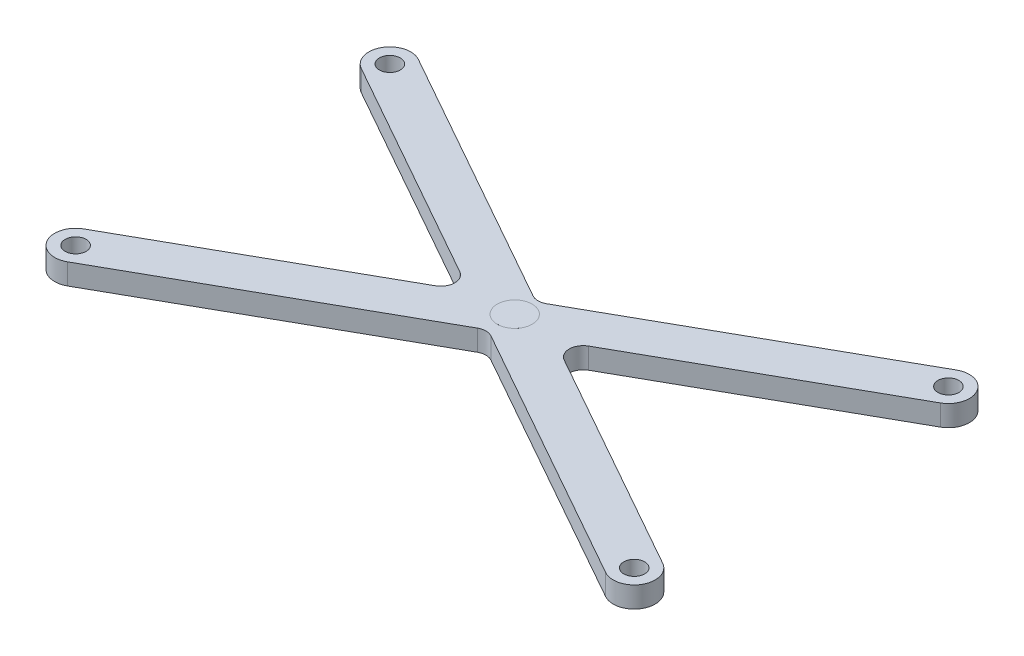
ISO-10303-21;
HEADER;
FILE_DESCRIPTION(('STEP AP214'),'2;1');
FILE_NAME('part.step','',(''),(''),'','','');
FILE_SCHEMA(('AUTOMOTIVE_DESIGN { 1 0 10303 214 1 1 1 1 }'));
ENDSEC;
DATA;
#1=APPLICATION_CONTEXT('core data for automotive mechanical design processes');
#2=APPLICATION_PROTOCOL_DEFINITION('international standard','automotive_design',2000,#1);
#3=PRODUCT_CONTEXT('',#1,'mechanical');
#4=PRODUCT('Part','Part','',(#3));
#5=PRODUCT_RELATED_PRODUCT_CATEGORY('part','',(#4));
#6=PRODUCT_DEFINITION_FORMATION('','',#4);
#7=PRODUCT_DEFINITION_CONTEXT('part definition',#1,'design');
#8=PRODUCT_DEFINITION('design','',#6,#7);
#9=PRODUCT_DEFINITION_SHAPE('','',#8);
#10=(LENGTH_UNIT() NAMED_UNIT(*) SI_UNIT(.MILLI.,.METRE.));
#11=(NAMED_UNIT(*) PLANE_ANGLE_UNIT() SI_UNIT($,.RADIAN.));
#12=(NAMED_UNIT(*) SI_UNIT($,.STERADIAN.) SOLID_ANGLE_UNIT());
#13=UNCERTAINTY_MEASURE_WITH_UNIT(LENGTH_MEASURE(1.E-05),#10,'distance_accuracy_value','');
#14=(GEOMETRIC_REPRESENTATION_CONTEXT(3) GLOBAL_UNCERTAINTY_ASSIGNED_CONTEXT((#13)) GLOBAL_UNIT_ASSIGNED_CONTEXT((#10,
#11,#12)) REPRESENTATION_CONTEXT('',''));
#15=CARTESIAN_POINT('',(0.,0.,0.));
#16=DIRECTION('',(0.,0.,1.));
#17=DIRECTION('',(1.,0.,0.));
#18=AXIS2_PLACEMENT_3D('',#15,#16,#17);
#19=CARTESIAN_POINT('',(0.,3.,-45.));
#20=DIRECTION('',(0.,1.,0.));
#21=DIRECTION('',(0.,0.,1.));
#22=AXIS2_PLACEMENT_3D('',#19,#20,#21);
#23=PLANE('',#22);
#24=CARTESIAN_POINT('',(39.9795141803523,3.,-22.909712693945));
#25=DIRECTION('',(0.,1.,0.));
#26=DIRECTION('',(0.,0.,1.));
#27=AXIS2_PLACEMENT_3D('',#24,#25,#26);
#28=CIRCLE('',#27,2.5);
#29=CARTESIAN_POINT('',(39.9795141803523,3.,-20.409712693945));
#30=VERTEX_POINT('',#29);
#31=EDGE_CURVE('E348',#30,#30,#28,.T.);
#32=ORIENTED_EDGE('',*,*,#31,.F.);
#33=EDGE_LOOP('',(#32));
#34=FACE_BOUND('',#33,.T.);
#35=CARTESIAN_POINT('',(80.,3.,0.));
#36=DIRECTION('',(0.,1.,0.));
#37=DIRECTION('',(0.,0.,1.));
#38=AXIS2_PLACEMENT_3D('',#35,#36,#37);
#39=CIRCLE('',#38,1.5);
#40=CARTESIAN_POINT('',(80.,3.,1.5));
#41=VERTEX_POINT('',#40);
#42=EDGE_CURVE('E359',#41,#41,#39,.T.);
#43=ORIENTED_EDGE('',*,*,#42,.F.);
#44=EDGE_LOOP('',(#43));
#45=FACE_BOUND('',#44,.T.);
#46=CARTESIAN_POINT('',(0.,3.,-45.));
#47=DIRECTION('',(0.,1.,0.));
#48=DIRECTION('',(0.,0.,1.));
#49=AXIS2_PLACEMENT_3D('',#46,#47,#48);
#50=CIRCLE('',#49,1.5);
#51=CARTESIAN_POINT('',(0.,3.,-43.5));
#52=VERTEX_POINT('',#51);
#53=EDGE_CURVE('E187',#52,#52,#50,.T.);
#54=ORIENTED_EDGE('',*,*,#53,.F.);
#55=EDGE_LOOP('',(#54));
#56=FACE_BOUND('',#55,.T.);
#57=CARTESIAN_POINT('',(0.,3.,-45.));
#58=DIRECTION('',(0.,1.,0.));
#59=DIRECTION('',(0.,0.,1.));
#60=AXIS2_PLACEMENT_3D('',#57,#58,#59);
#61=CIRCLE('',#60,3.);
#62=CARTESIAN_POINT('',(1.47012033383114,3.,-47.6150996547084));
#63=VERTEX_POINT('',#62);
#64=CARTESIAN_POINT('',(-1.47182511548262,3.,-42.3858594472687));
#65=VERTEX_POINT('',#64);
#66=EDGE_CURVE('E214',#63,#65,#61,.T.);
#67=ORIENTED_EDGE('',*,*,#66,.T.);
#68=DIRECTION('',(0.871575536369019,0.,0.490261240975724));
#69=VECTOR('',#68,1.);
#70=CARTESIAN_POINT('',(-1.47182511548262,3.,-42.3858594472687));
#71=LINE('',#70,#69);
#72=CARTESIAN_POINT('',(30.7818785451361,3.,-24.243151072738));
#73=VERTEX_POINT('',#72);
#74=EDGE_CURVE('E122',#65,#73,#71,.T.);
#75=ORIENTED_EDGE('',*,*,#74,.T.);
#76=CARTESIAN_POINT('',(29.8013560631847,3.,-22.5));
#77=DIRECTION('',(0.,-1.,0.));
#78=DIRECTION('',(0.,0.,1.));
#79=AXIS2_PLACEMENT_3D('',#76,#77,#78);
#80=CIRCLE('',#79,2.);
#81=CARTESIAN_POINT('',(30.7818785451361,3.,-20.756848927262));
#82=VERTEX_POINT('',#81);
#83=EDGE_CURVE('E253',#73,#82,#80,.T.);
#84=ORIENTED_EDGE('',*,*,#83,.T.);
#85=DIRECTION('',(-0.871575536369019,0.,0.490261240975724));
#86=VECTOR('',#85,1.);
#87=CARTESIAN_POINT('',(-1.47182511548262,3.,-2.61414055273135));
#88=LINE('',#87,#86);
#89=CARTESIAN_POINT('',(-1.47182511548262,3.,-2.61414055273135));
#90=VERTEX_POINT('',#89);
#91=EDGE_CURVE('E272',#82,#90,#88,.T.);
#92=ORIENTED_EDGE('',*,*,#91,.T.);
#93=CARTESIAN_POINT('',(0.,3.,0.));
#94=DIRECTION('',(0.,1.,0.));
#95=DIRECTION('',(0.,0.,1.));
#96=AXIS2_PLACEMENT_3D('',#93,#94,#95);
#97=CIRCLE('',#96,3.);
#98=CARTESIAN_POINT('',(1.47012033383113,3.,2.61509965470845));
#99=VERTEX_POINT('',#98);
#100=EDGE_CURVE('E269',#90,#99,#97,.T.);
#101=ORIENTED_EDGE('',*,*,#100,.T.);
#102=DIRECTION('',(0.871575536369019,0.,-0.490261240975724));
#103=VECTOR('',#102,1.);
#104=CARTESIAN_POINT('',(1.47012033383113,3.,2.61509965470845));
#105=LINE('',#104,#103);
#106=CARTESIAN_POINT('',(39.0194775180486,3.,-18.5064138375896));
#107=VERTEX_POINT('',#106);
#108=EDGE_CURVE('E271',#99,#107,#105,.T.);
#109=ORIENTED_EDGE('',*,*,#108,.T.);
#110=CARTESIAN_POINT('',(40.,3.,-16.7632627648516));
#111=DIRECTION('',(0.,-1.,0.));
#112=DIRECTION('',(0.,0.,-1.));
#113=AXIS2_PLACEMENT_3D('',#110,#111,#112);
#114=CIRCLE('',#113,2.);
#115=CARTESIAN_POINT('',(40.9805224819515,3.,-18.5064138375896));
#116=VERTEX_POINT('',#115);
#117=EDGE_CURVE('E274',#107,#116,#114,.T.);
#118=ORIENTED_EDGE('',*,*,#117,.T.);
#119=DIRECTION('',(0.871575536369019,0.,0.490261240975724));
#120=VECTOR('',#119,1.);
#121=CARTESIAN_POINT('',(40.9805224819515,3.,-18.5064138375896));
#122=LINE('',#121,#120);
#123=CARTESIAN_POINT('',(78.5298796661689,3.,2.61509965470845));
#124=VERTEX_POINT('',#123);
#125=EDGE_CURVE('E280',#116,#124,#122,.T.);
#126=ORIENTED_EDGE('',*,*,#125,.T.);
#127=CARTESIAN_POINT('',(80.,3.,0.));
#128=DIRECTION('',(0.,1.,0.));
#129=DIRECTION('',(0.,0.,1.));
#130=AXIS2_PLACEMENT_3D('',#127,#128,#129);
#131=CIRCLE('',#130,3.);
#132=CARTESIAN_POINT('',(81.4718251154826,3.,-2.61414055273136));
#133=VERTEX_POINT('',#132);
#134=EDGE_CURVE('E282',#124,#133,#131,.T.);
#135=ORIENTED_EDGE('',*,*,#134,.T.);
#136=DIRECTION('',(-0.871575536369019,0.,-0.490261240975724));
#137=VECTOR('',#136,1.);
#138=CARTESIAN_POINT('',(49.2181214548639,3.,-20.756848927262));
#139=LINE('',#138,#137);
#140=CARTESIAN_POINT('',(49.2181214548639,3.,-20.756848927262));
#141=VERTEX_POINT('',#140);
#142=EDGE_CURVE('E284',#133,#141,#139,.T.);
#143=ORIENTED_EDGE('',*,*,#142,.T.);
#144=CARTESIAN_POINT('',(50.1986439368153,3.,-22.5));
#145=DIRECTION('',(0.,-1.,0.));
#146=DIRECTION('',(0.,0.,-1.));
#147=AXIS2_PLACEMENT_3D('',#144,#145,#146);
#148=CIRCLE('',#147,2.);
#149=CARTESIAN_POINT('',(49.2181214548639,3.,-24.243151072738));
#150=VERTEX_POINT('',#149);
#151=EDGE_CURVE('E286',#141,#150,#148,.T.);
#152=ORIENTED_EDGE('',*,*,#151,.T.);
#153=DIRECTION('',(0.871575536369019,0.,-0.490261240975724));
#154=VECTOR('',#153,1.);
#155=CARTESIAN_POINT('',(49.2181214548639,3.,-24.243151072738));
#156=LINE('',#155,#154);
#157=CARTESIAN_POINT('',(81.4718251154826,3.,-42.3858594472687));
#158=VERTEX_POINT('',#157);
#159=EDGE_CURVE('E288',#150,#158,#156,.T.);
#160=ORIENTED_EDGE('',*,*,#159,.T.);
#161=CARTESIAN_POINT('',(80.,3.,-45.));
#162=DIRECTION('',(0.,1.,0.));
#163=DIRECTION('',(0.,0.,1.));
#164=AXIS2_PLACEMENT_3D('',#161,#162,#163);
#165=CIRCLE('',#164,3.);
#166=CARTESIAN_POINT('',(78.5298796661689,3.,-47.6150996547084));
#167=VERTEX_POINT('',#166);
#168=EDGE_CURVE('E165',#158,#167,#165,.T.);
#169=ORIENTED_EDGE('',*,*,#168,.T.);
#170=DIRECTION('',(-0.871575536369019,0.,0.490261240975724));
#171=VECTOR('',#170,1.);
#172=CARTESIAN_POINT('',(40.9805224819515,3.,-26.4935861624104));
#173=LINE('',#172,#171);
#174=CARTESIAN_POINT('',(40.9805224819515,3.,-26.4935861624104));
#175=VERTEX_POINT('',#174);
#176=EDGE_CURVE('E159',#167,#175,#173,.T.);
#177=ORIENTED_EDGE('',*,*,#176,.T.);
#178=CARTESIAN_POINT('',(40.,3.,-28.2367372351484));
#179=DIRECTION('',(0.,-1.,0.));
#180=DIRECTION('',(0.,0.,-1.));
#181=AXIS2_PLACEMENT_3D('',#178,#179,#180);
#182=CIRCLE('',#181,2.);
#183=CARTESIAN_POINT('',(39.0194775180486,3.,-26.4935861624104));
#184=VERTEX_POINT('',#183);
#185=EDGE_CURVE('E163',#175,#184,#182,.T.);
#186=ORIENTED_EDGE('',*,*,#185,.T.);
#187=DIRECTION('',(-0.871575536369019,0.,-0.490261240975724));
#188=VECTOR('',#187,1.);
#189=CARTESIAN_POINT('',(1.47012033383114,3.,-47.6150996547084));
#190=LINE('',#189,#188);
#191=EDGE_CURVE('E55',#184,#63,#190,.T.);
#192=ORIENTED_EDGE('',*,*,#191,.T.);
#193=EDGE_LOOP('',(#67,#75,#84,#92,#101,#109,#118,#126,#135,#143,#152,#160,#169,#177,#186,#192));
#194=FACE_BOUND('',#193,.T.);
#195=CARTESIAN_POINT('',(80.,3.,-45.));
#196=DIRECTION('',(0.,1.,0.));
#197=DIRECTION('',(0.,0.,1.));
#198=AXIS2_PLACEMENT_3D('',#195,#196,#197);
#199=CIRCLE('',#198,1.5);
#200=CARTESIAN_POINT('',(80.,3.,-43.5));
#201=VERTEX_POINT('',#200);
#202=EDGE_CURVE('E365',#201,#201,#199,.T.);
#203=ORIENTED_EDGE('',*,*,#202,.F.);
#204=EDGE_LOOP('',(#203));
#205=FACE_BOUND('',#204,.T.);
#206=CARTESIAN_POINT('',(0.,3.,0.));
#207=DIRECTION('',(0.,1.,0.));
#208=DIRECTION('',(0.,0.,1.));
#209=AXIS2_PLACEMENT_3D('',#206,#207,#208);
#210=CIRCLE('',#209,1.5);
#211=CARTESIAN_POINT('',(0.,3.,1.5));
#212=VERTEX_POINT('',#211);
#213=EDGE_CURVE('E351',#212,#212,#210,.T.);
#214=ORIENTED_EDGE('',*,*,#213,.F.);
#215=EDGE_LOOP('',(#214));
#216=FACE_BOUND('',#215,.T.);
#217=ADVANCED_FACE('F38',(#34,#45,#56,#194,#205,#216),#23,.T.);
#218=CARTESIAN_POINT('',(0.,0.,-45.));
#219=DIRECTION('',(0.,1.,0.));
#220=DIRECTION('',(0.,0.,1.));
#221=AXIS2_PLACEMENT_3D('',#218,#219,#220);
#222=PLANE('',#221);
#223=CARTESIAN_POINT('',(0.,0.,-45.));
#224=DIRECTION('',(0.,1.,0.));
#225=DIRECTION('',(0.,0.,1.));
#226=AXIS2_PLACEMENT_3D('',#223,#224,#225);
#227=CIRCLE('',#226,3.);
#228=CARTESIAN_POINT('',(1.47012033383114,0.,-47.6150996547084));
#229=VERTEX_POINT('',#228);
#230=CARTESIAN_POINT('',(-1.47182511548262,0.,-42.3858594472687));
#231=VERTEX_POINT('',#230);
#232=EDGE_CURVE('E183',#229,#231,#227,.T.);
#233=ORIENTED_EDGE('',*,*,#232,.F.);
#234=DIRECTION('',(-0.871575536369019,0.,-0.490261240975724));
#235=VECTOR('',#234,1.);
#236=CARTESIAN_POINT('',(1.47012033383114,0.,-47.6150996547084));
#237=LINE('',#236,#235);
#238=CARTESIAN_POINT('',(39.0194775180486,0.,-26.4935861624104));
#239=VERTEX_POINT('',#238);
#240=EDGE_CURVE('E114',#239,#229,#237,.T.);
#241=ORIENTED_EDGE('',*,*,#240,.F.);
#242=CARTESIAN_POINT('',(40.,0.,-28.2367372351484));
#243=DIRECTION('',(0.,-1.,0.));
#244=DIRECTION('',(0.,0.,-1.));
#245=AXIS2_PLACEMENT_3D('',#242,#243,#244);
#246=CIRCLE('',#245,2.);
#247=CARTESIAN_POINT('',(40.9805224819515,0.,-26.4935861624104));
#248=VERTEX_POINT('',#247);
#249=EDGE_CURVE('E108',#248,#239,#246,.T.);
#250=ORIENTED_EDGE('',*,*,#249,.F.);
#251=DIRECTION('',(-0.871575536369019,0.,0.490261240975724));
#252=VECTOR('',#251,1.);
#253=CARTESIAN_POINT('',(40.9805224819515,0.,-26.4935861624104));
#254=LINE('',#253,#252);
#255=CARTESIAN_POINT('',(78.5298796661689,0.,-47.6150996547084));
#256=VERTEX_POINT('',#255);
#257=EDGE_CURVE('E173',#256,#248,#254,.T.);
#258=ORIENTED_EDGE('',*,*,#257,.F.);
#259=CARTESIAN_POINT('',(80.,0.,-45.));
#260=DIRECTION('',(0.,1.,0.));
#261=DIRECTION('',(0.,0.,1.));
#262=AXIS2_PLACEMENT_3D('',#259,#260,#261);
#263=CIRCLE('',#262,3.);
#264=CARTESIAN_POINT('',(81.4718251154826,0.,-42.3858594472687));
#265=VERTEX_POINT('',#264);
#266=EDGE_CURVE('E209',#265,#256,#263,.T.);
#267=ORIENTED_EDGE('',*,*,#266,.F.);
#268=DIRECTION('',(0.871575536369019,0.,-0.490261240975724));
#269=VECTOR('',#268,1.);
#270=CARTESIAN_POINT('',(49.2181214548639,0.,-24.243151072738));
#271=LINE('',#270,#269);
#272=CARTESIAN_POINT('',(49.2181214548639,0.,-24.243151072738));
#273=VERTEX_POINT('',#272);
#274=EDGE_CURVE('E207',#273,#265,#271,.T.);
#275=ORIENTED_EDGE('',*,*,#274,.F.);
#276=CARTESIAN_POINT('',(50.1986439368153,0.,-22.5));
#277=DIRECTION('',(0.,-1.,0.));
#278=DIRECTION('',(0.,0.,-1.));
#279=AXIS2_PLACEMENT_3D('',#276,#277,#278);
#280=CIRCLE('',#279,2.);
#281=CARTESIAN_POINT('',(49.2181214548639,0.,-20.756848927262));
#282=VERTEX_POINT('',#281);
#283=EDGE_CURVE('E205',#282,#273,#280,.T.);
#284=ORIENTED_EDGE('',*,*,#283,.F.);
#285=DIRECTION('',(-0.871575536369019,0.,-0.490261240975724));
#286=VECTOR('',#285,1.);
#287=CARTESIAN_POINT('',(49.2181214548639,0.,-20.756848927262));
#288=LINE('',#287,#286);
#289=CARTESIAN_POINT('',(81.4718251154826,0.,-2.61414055273136));
#290=VERTEX_POINT('',#289);
#291=EDGE_CURVE('E203',#290,#282,#288,.T.);
#292=ORIENTED_EDGE('',*,*,#291,.F.);
#293=CARTESIAN_POINT('',(80.,0.,0.));
#294=DIRECTION('',(0.,1.,0.));
#295=DIRECTION('',(0.,0.,1.));
#296=AXIS2_PLACEMENT_3D('',#293,#294,#295);
#297=CIRCLE('',#296,3.);
#298=CARTESIAN_POINT('',(78.5298796661689,0.,2.61509965470845));
#299=VERTEX_POINT('',#298);
#300=EDGE_CURVE('E201',#299,#290,#297,.T.);
#301=ORIENTED_EDGE('',*,*,#300,.F.);
#302=DIRECTION('',(0.871575536369019,0.,0.490261240975724));
#303=VECTOR('',#302,1.);
#304=CARTESIAN_POINT('',(40.9805224819515,0.,-18.5064138375896));
#305=LINE('',#304,#303);
#306=CARTESIAN_POINT('',(40.9805224819515,0.,-18.5064138375896));
#307=VERTEX_POINT('',#306);
#308=EDGE_CURVE('E199',#307,#299,#305,.T.);
#309=ORIENTED_EDGE('',*,*,#308,.F.);
#310=CARTESIAN_POINT('',(40.,0.,-16.7632627648516));
#311=DIRECTION('',(0.,-1.,0.));
#312=DIRECTION('',(0.,0.,-1.));
#313=AXIS2_PLACEMENT_3D('',#310,#311,#312);
#314=CIRCLE('',#313,2.);
#315=CARTESIAN_POINT('',(39.0194775180486,0.,-18.5064138375896));
#316=VERTEX_POINT('',#315);
#317=EDGE_CURVE('E197',#316,#307,#314,.T.);
#318=ORIENTED_EDGE('',*,*,#317,.F.);
#319=DIRECTION('',(0.871575536369019,0.,-0.490261240975724));
#320=VECTOR('',#319,1.);
#321=CARTESIAN_POINT('',(1.47012033383113,0.,2.61509965470845));
#322=LINE('',#321,#320);
#323=CARTESIAN_POINT('',(1.47012033383113,0.,2.61509965470845));
#324=VERTEX_POINT('',#323);
#325=EDGE_CURVE('E195',#324,#316,#322,.T.);
#326=ORIENTED_EDGE('',*,*,#325,.F.);
#327=CARTESIAN_POINT('',(0.,0.,0.));
#328=DIRECTION('',(0.,1.,0.));
#329=DIRECTION('',(0.,0.,1.));
#330=AXIS2_PLACEMENT_3D('',#327,#328,#329);
#331=CIRCLE('',#330,3.);
#332=CARTESIAN_POINT('',(-1.47182511548262,0.,-2.61414055273135));
#333=VERTEX_POINT('',#332);
#334=EDGE_CURVE('E193',#333,#324,#331,.T.);
#335=ORIENTED_EDGE('',*,*,#334,.F.);
#336=DIRECTION('',(-0.871575536369019,0.,0.490261240975724));
#337=VECTOR('',#336,1.);
#338=CARTESIAN_POINT('',(-1.47182511548262,0.,-2.61414055273135));
#339=LINE('',#338,#337);
#340=CARTESIAN_POINT('',(30.7818785451361,0.,-20.756848927262));
#341=VERTEX_POINT('',#340);
#342=EDGE_CURVE('E191',#341,#333,#339,.T.);
#343=ORIENTED_EDGE('',*,*,#342,.F.);
#344=CARTESIAN_POINT('',(29.8013560631847,0.,-22.5));
#345=DIRECTION('',(0.,-1.,0.));
#346=DIRECTION('',(0.,0.,1.));
#347=AXIS2_PLACEMENT_3D('',#344,#345,#346);
#348=CIRCLE('',#347,2.);
#349=CARTESIAN_POINT('',(30.7818785451361,0.,-24.243151072738));
#350=VERTEX_POINT('',#349);
#351=EDGE_CURVE('E189',#350,#341,#348,.T.);
#352=ORIENTED_EDGE('',*,*,#351,.F.);
#353=DIRECTION('',(0.871575536369019,0.,0.490261240975724));
#354=VECTOR('',#353,1.);
#355=CARTESIAN_POINT('',(-1.47182511548262,0.,-42.3858594472687));
#356=LINE('',#355,#354);
#357=EDGE_CURVE('E186',#231,#350,#356,.T.);
#358=ORIENTED_EDGE('',*,*,#357,.F.);
#359=EDGE_LOOP('',(#233,#241,#250,#258,#267,#275,#284,#292,#301,#309,#318,#326,#335,#343,#352,#358));
#360=FACE_BOUND('',#359,.T.);
#361=CARTESIAN_POINT('',(0.,0.,-45.));
#362=DIRECTION('',(0.,1.,0.));
#363=DIRECTION('',(0.,0.,1.));
#364=AXIS2_PLACEMENT_3D('',#361,#362,#363);
#365=CIRCLE('',#364,1.5);
#366=CARTESIAN_POINT('',(0.,0.,-43.5));
#367=VERTEX_POINT('',#366);
#368=EDGE_CURVE('E368',#367,#367,#365,.T.);
#369=ORIENTED_EDGE('',*,*,#368,.T.);
#370=EDGE_LOOP('',(#369));
#371=FACE_BOUND('',#370,.T.);
#372=CARTESIAN_POINT('',(80.,0.,-45.));
#373=DIRECTION('',(0.,1.,0.));
#374=DIRECTION('',(0.,0.,1.));
#375=AXIS2_PLACEMENT_3D('',#372,#373,#374);
#376=CIRCLE('',#375,1.5);
#377=CARTESIAN_POINT('',(80.,0.,-43.5));
#378=VERTEX_POINT('',#377);
#379=EDGE_CURVE('E362',#378,#378,#376,.T.);
#380=ORIENTED_EDGE('',*,*,#379,.T.);
#381=EDGE_LOOP('',(#380));
#382=FACE_BOUND('',#381,.T.);
#383=CARTESIAN_POINT('',(80.,0.,0.));
#384=DIRECTION('',(0.,1.,0.));
#385=DIRECTION('',(0.,0.,1.));
#386=AXIS2_PLACEMENT_3D('',#383,#384,#385);
#387=CIRCLE('',#386,1.5);
#388=CARTESIAN_POINT('',(80.,0.,1.5));
#389=VERTEX_POINT('',#388);
#390=EDGE_CURVE('E357',#389,#389,#387,.T.);
#391=ORIENTED_EDGE('',*,*,#390,.T.);
#392=EDGE_LOOP('',(#391));
#393=FACE_BOUND('',#392,.T.);
#394=CARTESIAN_POINT('',(0.,0.,0.));
#395=DIRECTION('',(0.,1.,0.));
#396=DIRECTION('',(0.,0.,1.));
#397=AXIS2_PLACEMENT_3D('',#394,#395,#396);
#398=CIRCLE('',#397,1.5);
#399=CARTESIAN_POINT('',(0.,0.,1.5));
#400=VERTEX_POINT('',#399);
#401=EDGE_CURVE('E347',#400,#400,#398,.T.);
#402=ORIENTED_EDGE('',*,*,#401,.T.);
#403=EDGE_LOOP('',(#402));
#404=FACE_BOUND('',#403,.T.);
#405=ADVANCED_FACE('F257',(#360,#371,#382,#393,#404),#222,.F.);
#406=CARTESIAN_POINT('',(0.,3.,-45.));
#407=DIRECTION('',(0.,-1.,0.));
#408=DIRECTION('',(0.,0.,-1.));
#409=AXIS2_PLACEMENT_3D('',#406,#407,#408);
#410=CYLINDRICAL_SURFACE('',#409,3.);
#411=ORIENTED_EDGE('',*,*,#232,.T.);
#412=DIRECTION('',(0.,-1.,0.));
#413=VECTOR('',#412,1.);
#414=CARTESIAN_POINT('',(-1.47182511548262,3.,-42.3858594472687));
#415=LINE('',#414,#413);
#416=EDGE_CURVE('E11',#65,#231,#415,.T.);
#417=ORIENTED_EDGE('',*,*,#416,.F.);
#418=ORIENTED_EDGE('',*,*,#66,.F.);
#419=DIRECTION('',(0.,-1.,0.));
#420=VECTOR('',#419,1.);
#421=CARTESIAN_POINT('',(1.47012033383114,3.,-47.6150996547084));
#422=LINE('',#421,#420);
#423=EDGE_CURVE('E179',#63,#229,#422,.T.);
#424=ORIENTED_EDGE('',*,*,#423,.T.);
#425=EDGE_LOOP('',(#411,#417,#418,#424));
#426=FACE_BOUND('',#425,.T.);
#427=ADVANCED_FACE('F40',(#426),#410,.T.);
#428=CARTESIAN_POINT('',(-1.47182511548262,3.,-42.3858594472687));
#429=DIRECTION('',(0.490261240975724,0.,-0.871575536369019));
#430=DIRECTION('',(-0.871575536369019,0.,-0.490261240975724));
#431=AXIS2_PLACEMENT_3D('',#428,#429,#430);
#432=PLANE('',#431);
#433=ORIENTED_EDGE('',*,*,#357,.T.);
#434=DIRECTION('',(0.,-1.,0.));
#435=VECTOR('',#434,1.);
#436=CARTESIAN_POINT('',(30.7818785451361,3.,-24.243151072738));
#437=LINE('',#436,#435);
#438=EDGE_CURVE('E47',#73,#350,#437,.T.);
#439=ORIENTED_EDGE('',*,*,#438,.F.);
#440=ORIENTED_EDGE('',*,*,#74,.F.);
#441=ORIENTED_EDGE('',*,*,#416,.T.);
#442=EDGE_LOOP('',(#433,#439,#440,#441));
#443=FACE_BOUND('',#442,.T.);
#444=ADVANCED_FACE('F533',(#443),#432,.F.);
#445=CARTESIAN_POINT('',(29.8013560631847,3.,-22.5));
#446=DIRECTION('',(0.,-1.,0.));
#447=DIRECTION('',(0.,0.,-1.));
#448=AXIS2_PLACEMENT_3D('',#445,#446,#447);
#449=CYLINDRICAL_SURFACE('',#448,2.);
#450=ORIENTED_EDGE('',*,*,#351,.T.);
#451=DIRECTION('',(0.,-1.,0.));
#452=VECTOR('',#451,1.);
#453=CARTESIAN_POINT('',(30.7818785451361,3.,-20.756848927262));
#454=LINE('',#453,#452);
#455=EDGE_CURVE('E245',#82,#341,#454,.T.);
#456=ORIENTED_EDGE('',*,*,#455,.F.);
#457=ORIENTED_EDGE('',*,*,#83,.F.);
#458=ORIENTED_EDGE('',*,*,#438,.T.);
#459=EDGE_LOOP('',(#450,#456,#457,#458));
#460=FACE_BOUND('',#459,.T.);
#461=ADVANCED_FACE('F251',(#460),#449,.F.);
#462=CARTESIAN_POINT('',(-1.47182511548262,3.,-2.61414055273135));
#463=DIRECTION('',(0.490261240975724,0.,0.871575536369019));
#464=DIRECTION('',(0.871575536369019,0.,-0.490261240975724));
#465=AXIS2_PLACEMENT_3D('',#462,#463,#464);
#466=PLANE('',#465);
#467=ORIENTED_EDGE('',*,*,#342,.T.);
#468=DIRECTION('',(0.,-1.,0.));
#469=VECTOR('',#468,1.);
#470=CARTESIAN_POINT('',(-1.47182511548262,3.,-2.61414055273135));
#471=LINE('',#470,#469);
#472=EDGE_CURVE('E242',#90,#333,#471,.T.);
#473=ORIENTED_EDGE('',*,*,#472,.F.);
#474=ORIENTED_EDGE('',*,*,#91,.F.);
#475=ORIENTED_EDGE('',*,*,#455,.T.);
#476=EDGE_LOOP('',(#467,#473,#474,#475));
#477=FACE_BOUND('',#476,.T.);
#478=ADVANCED_FACE('F263',(#477),#466,.F.);
#479=CARTESIAN_POINT('',(0.,3.,0.));
#480=DIRECTION('',(0.,-1.,0.));
#481=DIRECTION('',(0.,0.,-1.));
#482=AXIS2_PLACEMENT_3D('',#479,#480,#481);
#483=CYLINDRICAL_SURFACE('',#482,3.);
#484=ORIENTED_EDGE('',*,*,#334,.T.);
#485=DIRECTION('',(0.,-1.,0.));
#486=VECTOR('',#485,1.);
#487=CARTESIAN_POINT('',(1.47012033383113,3.,2.61509965470845));
#488=LINE('',#487,#486);
#489=EDGE_CURVE('E239',#99,#324,#488,.T.);
#490=ORIENTED_EDGE('',*,*,#489,.F.);
#491=ORIENTED_EDGE('',*,*,#100,.F.);
#492=ORIENTED_EDGE('',*,*,#472,.T.);
#493=EDGE_LOOP('',(#484,#490,#491,#492));
#494=FACE_BOUND('',#493,.T.);
#495=ADVANCED_FACE('F267',(#494),#483,.T.);
#496=CARTESIAN_POINT('',(1.47012033383113,3.,2.61509965470845));
#497=DIRECTION('',(-0.490261240975724,0.,-0.871575536369019));
#498=DIRECTION('',(-0.871575536369019,0.,0.490261240975724));
#499=AXIS2_PLACEMENT_3D('',#496,#497,#498);
#500=PLANE('',#499);
#501=ORIENTED_EDGE('',*,*,#325,.T.);
#502=DIRECTION('',(0.,-1.,0.));
#503=VECTOR('',#502,1.);
#504=CARTESIAN_POINT('',(39.0194775180486,3.,-18.5064138375896));
#505=LINE('',#504,#503);
#506=EDGE_CURVE('E236',#107,#316,#505,.T.);
#507=ORIENTED_EDGE('',*,*,#506,.F.);
#508=ORIENTED_EDGE('',*,*,#108,.F.);
#509=ORIENTED_EDGE('',*,*,#489,.T.);
#510=EDGE_LOOP('',(#501,#507,#508,#509));
#511=FACE_BOUND('',#510,.T.);
#512=ADVANCED_FACE('F498',(#511),#500,.F.);
#513=CARTESIAN_POINT('',(40.,3.,-16.7632627648516));
#514=DIRECTION('',(0.,-1.,0.));
#515=DIRECTION('',(0.,0.,-1.));
#516=AXIS2_PLACEMENT_3D('',#513,#514,#515);
#517=CYLINDRICAL_SURFACE('',#516,2.);
#518=ORIENTED_EDGE('',*,*,#317,.T.);
#519=DIRECTION('',(0.,-1.,0.));
#520=VECTOR('',#519,1.);
#521=CARTESIAN_POINT('',(40.9805224819515,3.,-18.5064138375896));
#522=LINE('',#521,#520);
#523=EDGE_CURVE('E233',#116,#307,#522,.T.);
#524=ORIENTED_EDGE('',*,*,#523,.F.);
#525=ORIENTED_EDGE('',*,*,#117,.F.);
#526=ORIENTED_EDGE('',*,*,#506,.T.);
#527=EDGE_LOOP('',(#518,#524,#525,#526));
#528=FACE_BOUND('',#527,.T.);
#529=ADVANCED_FACE('F488',(#528),#517,.F.);
#530=CARTESIAN_POINT('',(40.9805224819515,3.,-18.5064138375896));
#531=DIRECTION('',(0.490261240975724,0.,-0.871575536369019));
#532=DIRECTION('',(-0.871575536369019,0.,-0.490261240975724));
#533=AXIS2_PLACEMENT_3D('',#530,#531,#532);
#534=PLANE('',#533);
#535=ORIENTED_EDGE('',*,*,#308,.T.);
#536=DIRECTION('',(0.,-1.,0.));
#537=VECTOR('',#536,1.);
#538=CARTESIAN_POINT('',(78.5298796661689,3.,2.61509965470845));
#539=LINE('',#538,#537);
#540=EDGE_CURVE('E230',#124,#299,#539,.T.);
#541=ORIENTED_EDGE('',*,*,#540,.F.);
#542=ORIENTED_EDGE('',*,*,#125,.F.);
#543=ORIENTED_EDGE('',*,*,#523,.T.);
#544=EDGE_LOOP('',(#535,#541,#542,#543));
#545=FACE_BOUND('',#544,.T.);
#546=ADVANCED_FACE('F478',(#545),#534,.F.);
#547=CARTESIAN_POINT('',(80.,3.,0.));
#548=DIRECTION('',(0.,-1.,0.));
#549=DIRECTION('',(0.,0.,-1.));
#550=AXIS2_PLACEMENT_3D('',#547,#548,#549);
#551=CYLINDRICAL_SURFACE('',#550,3.);
#552=ORIENTED_EDGE('',*,*,#300,.T.);
#553=DIRECTION('',(0.,-1.,0.));
#554=VECTOR('',#553,1.);
#555=CARTESIAN_POINT('',(81.4718251154826,3.,-2.61414055273136));
#556=LINE('',#555,#554);
#557=EDGE_CURVE('E227',#133,#290,#556,.T.);
#558=ORIENTED_EDGE('',*,*,#557,.F.);
#559=ORIENTED_EDGE('',*,*,#134,.F.);
#560=ORIENTED_EDGE('',*,*,#540,.T.);
#561=EDGE_LOOP('',(#552,#558,#559,#560));
#562=FACE_BOUND('',#561,.T.);
#563=ADVANCED_FACE('F468',(#562),#551,.T.);
#564=CARTESIAN_POINT('',(49.2181214548639,3.,-20.756848927262));
#565=DIRECTION('',(-0.490261240975724,0.,0.871575536369019));
#566=DIRECTION('',(0.871575536369019,0.,0.490261240975724));
#567=AXIS2_PLACEMENT_3D('',#564,#565,#566);
#568=PLANE('',#567);
#569=ORIENTED_EDGE('',*,*,#291,.T.);
#570=DIRECTION('',(0.,-1.,0.));
#571=VECTOR('',#570,1.);
#572=CARTESIAN_POINT('',(49.2181214548639,3.,-20.756848927262));
#573=LINE('',#572,#571);
#574=EDGE_CURVE('E224',#141,#282,#573,.T.);
#575=ORIENTED_EDGE('',*,*,#574,.F.);
#576=ORIENTED_EDGE('',*,*,#142,.F.);
#577=ORIENTED_EDGE('',*,*,#557,.T.);
#578=EDGE_LOOP('',(#569,#575,#576,#577));
#579=FACE_BOUND('',#578,.T.);
#580=ADVANCED_FACE('F458',(#579),#568,.F.);
#581=CARTESIAN_POINT('',(50.1986439368153,3.,-22.5));
#582=DIRECTION('',(0.,-1.,0.));
#583=DIRECTION('',(0.,0.,-1.));
#584=AXIS2_PLACEMENT_3D('',#581,#582,#583);
#585=CYLINDRICAL_SURFACE('',#584,2.);
#586=ORIENTED_EDGE('',*,*,#283,.T.);
#587=DIRECTION('',(0.,-1.,0.));
#588=VECTOR('',#587,1.);
#589=CARTESIAN_POINT('',(49.2181214548639,3.,-24.243151072738));
#590=LINE('',#589,#588);
#591=EDGE_CURVE('E221',#150,#273,#590,.T.);
#592=ORIENTED_EDGE('',*,*,#591,.F.);
#593=ORIENTED_EDGE('',*,*,#151,.F.);
#594=ORIENTED_EDGE('',*,*,#574,.T.);
#595=EDGE_LOOP('',(#586,#592,#593,#594));
#596=FACE_BOUND('',#595,.T.);
#597=ADVANCED_FACE('F449',(#596),#585,.F.);
#598=CARTESIAN_POINT('',(49.2181214548639,3.,-24.243151072738));
#599=DIRECTION('',(-0.490261240975724,0.,-0.871575536369019));
#600=DIRECTION('',(-0.871575536369019,0.,0.490261240975724));
#601=AXIS2_PLACEMENT_3D('',#598,#599,#600);
#602=PLANE('',#601);
#603=ORIENTED_EDGE('',*,*,#274,.T.);
#604=DIRECTION('',(0.,-1.,0.));
#605=VECTOR('',#604,1.);
#606=CARTESIAN_POINT('',(81.4718251154826,3.,-42.3858594472687));
#607=LINE('',#606,#605);
#608=EDGE_CURVE('E218',#158,#265,#607,.T.);
#609=ORIENTED_EDGE('',*,*,#608,.F.);
#610=ORIENTED_EDGE('',*,*,#159,.F.);
#611=ORIENTED_EDGE('',*,*,#591,.T.);
#612=EDGE_LOOP('',(#603,#609,#610,#611));
#613=FACE_BOUND('',#612,.T.);
#614=ADVANCED_FACE('F294',(#613),#602,.F.);
#615=CARTESIAN_POINT('',(80.,3.,-45.));
#616=DIRECTION('',(0.,-1.,0.));
#617=DIRECTION('',(0.,0.,-1.));
#618=AXIS2_PLACEMENT_3D('',#615,#616,#617);
#619=CYLINDRICAL_SURFACE('',#618,3.);
#620=ORIENTED_EDGE('',*,*,#266,.T.);
#621=DIRECTION('',(0.,-1.,0.));
#622=VECTOR('',#621,1.);
#623=CARTESIAN_POINT('',(78.5298796661689,3.,-47.6150996547084));
#624=LINE('',#623,#622);
#625=EDGE_CURVE('E174',#167,#256,#624,.T.);
#626=ORIENTED_EDGE('',*,*,#625,.F.);
#627=ORIENTED_EDGE('',*,*,#168,.F.);
#628=ORIENTED_EDGE('',*,*,#608,.T.);
#629=EDGE_LOOP('',(#620,#626,#627,#628));
#630=FACE_BOUND('',#629,.T.);
#631=ADVANCED_FACE('F298',(#630),#619,.T.);
#632=CARTESIAN_POINT('',(40.9805224819515,3.,-26.4935861624104));
#633=DIRECTION('',(0.490261240975724,0.,0.871575536369019));
#634=DIRECTION('',(0.871575536369019,0.,-0.490261240975724));
#635=AXIS2_PLACEMENT_3D('',#632,#633,#634);
#636=PLANE('',#635);
#637=ORIENTED_EDGE('',*,*,#257,.T.);
#638=DIRECTION('',(0.,-1.,0.));
#639=VECTOR('',#638,1.);
#640=CARTESIAN_POINT('',(40.9805224819515,3.,-26.4935861624104));
#641=LINE('',#640,#639);
#642=EDGE_CURVE('E170',#175,#248,#641,.T.);
#643=ORIENTED_EDGE('',*,*,#642,.F.);
#644=ORIENTED_EDGE('',*,*,#176,.F.);
#645=ORIENTED_EDGE('',*,*,#625,.T.);
#646=EDGE_LOOP('',(#637,#643,#644,#645));
#647=FACE_BOUND('',#646,.T.);
#648=ADVANCED_FACE('F171',(#647),#636,.F.);
#649=CARTESIAN_POINT('',(40.,3.,-28.2367372351484));
#650=DIRECTION('',(0.,-1.,0.));
#651=DIRECTION('',(0.,0.,-1.));
#652=AXIS2_PLACEMENT_3D('',#649,#650,#651);
#653=CYLINDRICAL_SURFACE('',#652,2.);
#654=ORIENTED_EDGE('',*,*,#249,.T.);
#655=DIRECTION('',(0.,-1.,0.));
#656=VECTOR('',#655,1.);
#657=CARTESIAN_POINT('',(39.0194775180486,3.,-26.4935861624104));
#658=LINE('',#657,#656);
#659=EDGE_CURVE('E175',#184,#239,#658,.T.);
#660=ORIENTED_EDGE('',*,*,#659,.F.);
#661=ORIENTED_EDGE('',*,*,#185,.F.);
#662=ORIENTED_EDGE('',*,*,#642,.T.);
#663=EDGE_LOOP('',(#654,#660,#661,#662));
#664=FACE_BOUND('',#663,.T.);
#665=ADVANCED_FACE('F177',(#664),#653,.F.);
#666=CARTESIAN_POINT('',(1.47012033383114,3.,-47.6150996547084));
#667=DIRECTION('',(-0.490261240975724,0.,0.871575536369019));
#668=DIRECTION('',(0.871575536369019,0.,0.490261240975724));
#669=AXIS2_PLACEMENT_3D('',#666,#667,#668);
#670=PLANE('',#669);
#671=ORIENTED_EDGE('',*,*,#240,.T.);
#672=ORIENTED_EDGE('',*,*,#423,.F.);
#673=ORIENTED_EDGE('',*,*,#191,.F.);
#674=ORIENTED_EDGE('',*,*,#659,.T.);
#675=EDGE_LOOP('',(#671,#672,#673,#674));
#676=FACE_BOUND('',#675,.T.);
#677=ADVANCED_FACE('F302',(#676),#670,.F.);
#678=CARTESIAN_POINT('',(0.,3.,-45.));
#679=DIRECTION('',(0.,-1.,0.));
#680=DIRECTION('',(0.,0.,-1.));
#681=AXIS2_PLACEMENT_3D('',#678,#679,#680);
#682=CYLINDRICAL_SURFACE('',#681,1.5);
#683=ORIENTED_EDGE('',*,*,#53,.T.);
#684=EDGE_LOOP('',(#683));
#685=FACE_BOUND('',#684,.T.);
#686=ORIENTED_EDGE('',*,*,#368,.F.);
#687=EDGE_LOOP('',(#686));
#688=FACE_BOUND('',#687,.T.);
#689=ADVANCED_FACE('F304',(#685,#688),#682,.F.);
#690=CARTESIAN_POINT('',(80.,3.,-45.));
#691=DIRECTION('',(0.,-1.,0.));
#692=DIRECTION('',(0.,0.,-1.));
#693=AXIS2_PLACEMENT_3D('',#690,#691,#692);
#694=CYLINDRICAL_SURFACE('',#693,1.5);
#695=ORIENTED_EDGE('',*,*,#202,.T.);
#696=EDGE_LOOP('',(#695));
#697=FACE_BOUND('',#696,.T.);
#698=ORIENTED_EDGE('',*,*,#379,.F.);
#699=EDGE_LOOP('',(#698));
#700=FACE_BOUND('',#699,.T.);
#701=ADVANCED_FACE('F310',(#697,#700),#694,.F.);
#702=CARTESIAN_POINT('',(80.,3.,0.));
#703=DIRECTION('',(0.,-1.,0.));
#704=DIRECTION('',(0.,0.,-1.));
#705=AXIS2_PLACEMENT_3D('',#702,#703,#704);
#706=CYLINDRICAL_SURFACE('',#705,1.5);
#707=ORIENTED_EDGE('',*,*,#42,.T.);
#708=EDGE_LOOP('',(#707));
#709=FACE_BOUND('',#708,.T.);
#710=ORIENTED_EDGE('',*,*,#390,.F.);
#711=EDGE_LOOP('',(#710));
#712=FACE_BOUND('',#711,.T.);
#713=ADVANCED_FACE('F326',(#709,#712),#706,.F.);
#714=CARTESIAN_POINT('',(0.,3.,0.));
#715=DIRECTION('',(0.,-1.,0.));
#716=DIRECTION('',(0.,0.,-1.));
#717=AXIS2_PLACEMENT_3D('',#714,#715,#716);
#718=CYLINDRICAL_SURFACE('',#717,1.5);
#719=ORIENTED_EDGE('',*,*,#213,.T.);
#720=EDGE_LOOP('',(#719));
#721=FACE_BOUND('',#720,.T.);
#722=ORIENTED_EDGE('',*,*,#401,.F.);
#723=EDGE_LOOP('',(#722));
#724=FACE_BOUND('',#723,.T.);
#725=ADVANCED_FACE('F330',(#721,#724),#718,.F.);
#726=CARTESIAN_POINT('',(39.9795141803523,3.001,-22.909712693945));
#727=DIRECTION('',(0.,-1.,0.));
#728=DIRECTION('',(0.,0.,-1.));
#729=AXIS2_PLACEMENT_3D('',#726,#727,#728);
#730=CYLINDRICAL_SURFACE('',#729,2.5);
#731=CARTESIAN_POINT('',(39.9795141803523,3.001,-22.909712693945));
#732=DIRECTION('',(0.,1.,0.));
#733=DIRECTION('',(0.,0.,1.));
#734=AXIS2_PLACEMENT_3D('',#731,#732,#733);
#735=CIRCLE('',#734,2.5);
#736=CARTESIAN_POINT('',(39.9795141803523,3.001,-20.409712693945));
#737=VERTEX_POINT('',#736);
#738=EDGE_CURVE('E346',#737,#737,#735,.T.);
#739=ORIENTED_EDGE('',*,*,#738,.F.);
#740=EDGE_LOOP('',(#739));
#741=FACE_BOUND('',#740,.T.);
#742=ORIENTED_EDGE('',*,*,#31,.T.);
#743=EDGE_LOOP('',(#742));
#744=FACE_BOUND('',#743,.T.);
#745=ADVANCED_FACE('F334',(#741,#744),#730,.T.);
#746=CARTESIAN_POINT('',(39.9795141803523,3.001,-22.909712693945));
#747=DIRECTION('',(0.,1.,0.));
#748=DIRECTION('',(0.,0.,1.));
#749=AXIS2_PLACEMENT_3D('',#746,#747,#748);
#750=PLANE('',#749);
#751=ORIENTED_EDGE('',*,*,#738,.T.);
#752=EDGE_LOOP('',(#751));
#753=FACE_BOUND('',#752,.T.);
#754=ADVANCED_FACE('F338',(#753),#750,.T.);
#755=CLOSED_SHELL('',(#217,#405,#427,#444,#461,#478,#495,#512,#529,#546,#563,#580,#597,#614,
#631,#648,#665,#677,#689,#701,#713,#725,#745,#754));
#756=MANIFOLD_SOLID_BREP('B2',#755);
#757=ADVANCED_BREP_SHAPE_REPRESENTATION('',(#18,#756),#14);
#758=SHAPE_DEFINITION_REPRESENTATION(#9,#757);
ENDSEC;
END-ISO-10303-21;
